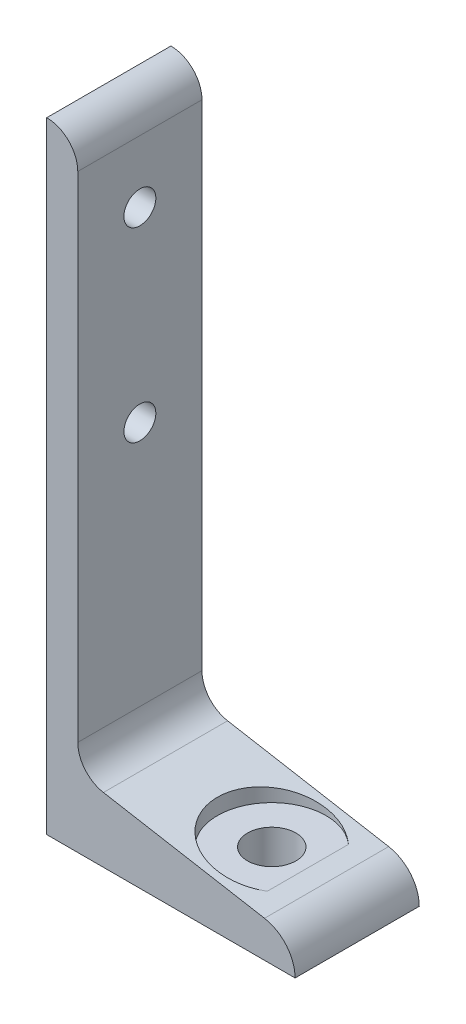
ISO-10303-21;
HEADER;
FILE_DESCRIPTION(('STEP AP214'),'2;1');
FILE_NAME('part.step','',(''),(''),'','','');
FILE_SCHEMA(('AUTOMOTIVE_DESIGN { 1 0 10303 214 1 1 1 1 }'));
ENDSEC;
DATA;
#1=APPLICATION_CONTEXT('core data for automotive mechanical design processes');
#2=APPLICATION_PROTOCOL_DEFINITION('international standard','automotive_design',2000,#1);
#3=PRODUCT_CONTEXT('',#1,'mechanical');
#4=PRODUCT('Part','Part','',(#3));
#5=PRODUCT_RELATED_PRODUCT_CATEGORY('part','',(#4));
#6=PRODUCT_DEFINITION_FORMATION('','',#4);
#7=PRODUCT_DEFINITION_CONTEXT('part definition',#1,'design');
#8=PRODUCT_DEFINITION('design','',#6,#7);
#9=PRODUCT_DEFINITION_SHAPE('','',#8);
#10=(LENGTH_UNIT() NAMED_UNIT(*) SI_UNIT(.MILLI.,.METRE.));
#11=(NAMED_UNIT(*) PLANE_ANGLE_UNIT() SI_UNIT($,.RADIAN.));
#12=(NAMED_UNIT(*) SI_UNIT($,.STERADIAN.) SOLID_ANGLE_UNIT());
#13=UNCERTAINTY_MEASURE_WITH_UNIT(LENGTH_MEASURE(1.E-05),#10,'distance_accuracy_value','');
#14=(GEOMETRIC_REPRESENTATION_CONTEXT(3) GLOBAL_UNCERTAINTY_ASSIGNED_CONTEXT((#13)) GLOBAL_UNIT_ASSIGNED_CONTEXT((#10,
#11,#12)) REPRESENTATION_CONTEXT('',''));
#15=CARTESIAN_POINT('',(0.,0.,0.));
#16=DIRECTION('',(0.,0.,1.));
#17=DIRECTION('',(1.,0.,0.));
#18=AXIS2_PLACEMENT_3D('',#15,#16,#17);
#19=CARTESIAN_POINT('',(6.34999999999999,120.65,12.7));
#20=DIRECTION('',(-1.,0.,0.));
#21=DIRECTION('',(0.,-1.,0.));
#22=AXIS2_PLACEMENT_3D('',#19,#20,#21);
#23=PLANE('',#22);
#24=CARTESIAN_POINT('',(6.35,69.85,0.));
#25=DIRECTION('',(-1.,0.,0.));
#26=DIRECTION('',(0.,-1.,0.));
#27=AXIS2_PLACEMENT_3D('',#24,#25,#26);
#28=CIRCLE('',#27,3.2639);
#29=CARTESIAN_POINT('',(6.35,66.5861,0.));
#30=VERTEX_POINT('',#29);
#31=EDGE_CURVE('E162',#30,#30,#28,.F.);
#32=ORIENTED_EDGE('',*,*,#31,.F.);
#33=EDGE_LOOP('',(#32));
#34=FACE_BOUND('',#33,.T.);
#35=DIRECTION('',(0.,1.,0.));
#36=VECTOR('',#35,1.);
#37=CARTESIAN_POINT('',(6.34999999999999,120.65,-12.7));
#38=LINE('',#37,#36);
#39=CARTESIAN_POINT('',(6.35000000000001,19.5160169504667,-12.7));
#40=VERTEX_POINT('',#39);
#41=CARTESIAN_POINT('',(6.34999999999999,120.65,-12.7));
#42=VERTEX_POINT('',#41);
#43=EDGE_CURVE('E120',#40,#42,#38,.T.);
#44=ORIENTED_EDGE('',*,*,#43,.T.);
#45=DIRECTION('',(0.,0.,-1.));
#46=VECTOR('',#45,1.);
#47=CARTESIAN_POINT('',(6.34999999999999,120.65,12.7));
#48=LINE('',#47,#46);
#49=CARTESIAN_POINT('',(6.34999999999999,120.65,12.7));
#50=VERTEX_POINT('',#49);
#51=EDGE_CURVE('E117',#50,#42,#48,.T.);
#52=ORIENTED_EDGE('',*,*,#51,.F.);
#53=DIRECTION('',(0.,1.,0.));
#54=VECTOR('',#53,1.);
#55=CARTESIAN_POINT('',(6.34999999999999,120.65,12.7));
#56=LINE('',#55,#54);
#57=CARTESIAN_POINT('',(6.35000000000001,19.5160169504667,12.7));
#58=VERTEX_POINT('',#57);
#59=EDGE_CURVE('E104',#58,#50,#56,.T.);
#60=ORIENTED_EDGE('',*,*,#59,.F.);
#61=DIRECTION('',(0.,0.,-1.));
#62=VECTOR('',#61,1.);
#63=CARTESIAN_POINT('',(6.35000000000001,19.5160169504667,12.7));
#64=LINE('',#63,#62);
#65=EDGE_CURVE('E123',#58,#40,#64,.T.);
#66=ORIENTED_EDGE('',*,*,#65,.T.);
#67=EDGE_LOOP('',(#44,#52,#60,#66));
#68=FACE_BOUND('',#67,.T.);
#69=CARTESIAN_POINT('',(6.34999999999999,107.95,0.));
#70=DIRECTION('',(-1.,0.,0.));
#71=DIRECTION('',(0.,-1.,0.));
#72=AXIS2_PLACEMENT_3D('',#69,#70,#71);
#73=CIRCLE('',#72,3.2639);
#74=CARTESIAN_POINT('',(6.34999999999999,104.6861,0.));
#75=VERTEX_POINT('',#74);
#76=EDGE_CURVE('E256',#75,#75,#73,.F.);
#77=ORIENTED_EDGE('',*,*,#76,.F.);
#78=EDGE_LOOP('',(#77));
#79=FACE_BOUND('',#78,.T.);
#80=ADVANCED_FACE('F32',(#34,#68,#79),#23,.F.);
#81=CARTESIAN_POINT('',(0.,0.,12.7));
#82=DIRECTION('',(1.,0.,0.));
#83=DIRECTION('',(0.,0.,-1.));
#84=AXIS2_PLACEMENT_3D('',#81,#82,#83);
#85=PLANE('',#84);
#86=CARTESIAN_POINT('',(0.,69.85,0.));
#87=DIRECTION('',(1.,0.,0.));
#88=DIRECTION('',(0.,0.,-1.));
#89=AXIS2_PLACEMENT_3D('',#86,#87,#88);
#90=CIRCLE('',#89,3.2639);
#91=CARTESIAN_POINT('',(0.,69.85,-3.2639));
#92=VERTEX_POINT('',#91);
#93=EDGE_CURVE('E165',#92,#92,#90,.T.);
#94=ORIENTED_EDGE('',*,*,#93,.T.);
#95=EDGE_LOOP('',(#94));
#96=FACE_BOUND('',#95,.T.);
#97=DIRECTION('',(0.,-1.,0.));
#98=VECTOR('',#97,1.);
#99=CARTESIAN_POINT('',(0.,0.,-12.7));
#100=LINE('',#99,#98);
#101=CARTESIAN_POINT('',(0.,127.,-12.7));
#102=VERTEX_POINT('',#101);
#103=CARTESIAN_POINT('',(0.,0.,-12.7));
#104=VERTEX_POINT('',#103);
#105=EDGE_CURVE('E84',#102,#104,#100,.T.);
#106=ORIENTED_EDGE('',*,*,#105,.T.);
#107=DIRECTION('',(0.,0.,-1.));
#108=VECTOR('',#107,1.);
#109=CARTESIAN_POINT('',(0.,0.,12.7));
#110=LINE('',#109,#108);
#111=CARTESIAN_POINT('',(0.,0.,12.7));
#112=VERTEX_POINT('',#111);
#113=EDGE_CURVE('E128',#112,#104,#110,.T.);
#114=ORIENTED_EDGE('',*,*,#113,.F.);
#115=DIRECTION('',(0.,-1.,0.));
#116=VECTOR('',#115,1.);
#117=CARTESIAN_POINT('',(0.,0.,12.7));
#118=LINE('',#117,#116);
#119=CARTESIAN_POINT('',(0.,127.,12.7));
#120=VERTEX_POINT('',#119);
#121=EDGE_CURVE('E54',#120,#112,#118,.T.);
#122=ORIENTED_EDGE('',*,*,#121,.F.);
#123=DIRECTION('',(0.,0.,-1.));
#124=VECTOR('',#123,1.);
#125=CARTESIAN_POINT('',(0.,127.,12.7));
#126=LINE('',#125,#124);
#127=EDGE_CURVE('E124',#120,#102,#126,.T.);
#128=ORIENTED_EDGE('',*,*,#127,.T.);
#129=EDGE_LOOP('',(#106,#114,#122,#128));
#130=FACE_BOUND('',#129,.T.);
#131=CARTESIAN_POINT('',(0.,107.95,0.));
#132=DIRECTION('',(1.,0.,0.));
#133=DIRECTION('',(0.,0.,-1.));
#134=AXIS2_PLACEMENT_3D('',#131,#132,#133);
#135=CIRCLE('',#134,3.2639);
#136=CARTESIAN_POINT('',(0.,107.95,-3.2639));
#137=VERTEX_POINT('',#136);
#138=EDGE_CURVE('E253',#137,#137,#135,.T.);
#139=ORIENTED_EDGE('',*,*,#138,.T.);
#140=EDGE_LOOP('',(#139));
#141=FACE_BOUND('',#140,.T.);
#142=ADVANCED_FACE('F186',(#96,#130,#141),#85,.F.);
#143=CARTESIAN_POINT('',(11.597334071815,13.2624877188392,12.7));
#144=DIRECTION('',(-0.173648177666923,-0.984807753012209,0.));
#145=DIRECTION('',(0.984807753012209,-0.173648177666923,0.));
#146=AXIS2_PLACEMENT_3D('',#143,#144,#145);
#147=PLANE('',#146);
#148=DIRECTION('',(-0.984807753012209,0.173648177666923,0.));
#149=VECTOR('',#148,1.);
#150=CARTESIAN_POINT('',(11.597334071815,13.2624877188392,-12.7));
#151=LINE('',#150,#149);
#152=CARTESIAN_POINT('',(44.5464707683725,7.45266592818496,-12.7));
#153=VERTEX_POINT('',#152);
#154=CARTESIAN_POINT('',(11.597334071815,13.2624877188392,-12.7));
#155=VERTEX_POINT('',#154);
#156=EDGE_CURVE('E138',#153,#155,#151,.T.);
#157=ORIENTED_EDGE('',*,*,#156,.T.);
#158=DIRECTION('',(0.,0.,-1.));
#159=VECTOR('',#158,1.);
#160=CARTESIAN_POINT('',(11.597334071815,13.2624877188392,12.7));
#161=LINE('',#160,#159);
#162=CARTESIAN_POINT('',(11.597334071815,13.2624877188392,12.7));
#163=VERTEX_POINT('',#162);
#164=EDGE_CURVE('E150',#163,#155,#161,.T.);
#165=ORIENTED_EDGE('',*,*,#164,.F.);
#166=DIRECTION('',(-0.984807753012209,0.173648177666923,0.));
#167=VECTOR('',#166,1.);
#168=CARTESIAN_POINT('',(11.597334071815,13.2624877188392,12.7));
#169=LINE('',#168,#167);
#170=CARTESIAN_POINT('',(44.5464707683725,7.45266592818496,12.7));
#171=VERTEX_POINT('',#170);
#172=EDGE_CURVE('E173',#171,#163,#169,.T.);
#173=ORIENTED_EDGE('',*,*,#172,.F.);
#174=DIRECTION('',(0.,0.,-1.));
#175=VECTOR('',#174,1.);
#176=CARTESIAN_POINT('',(44.5464707683725,7.45266592818496,12.7));
#177=LINE('',#176,#175);
#178=EDGE_CURVE('E153',#171,#153,#177,.T.);
#179=ORIENTED_EDGE('',*,*,#178,.T.);
#180=EDGE_LOOP('',(#157,#165,#173,#179));
#181=FACE_BOUND('',#180,.T.);
#182=CARTESIAN_POINT('',(33.3248,9.43134925327645,0.));
#183=DIRECTION('',(-0.173648177666923,-0.984807753012209,0.));
#184=DIRECTION('',(0.984807753012209,-0.173648177666923,0.));
#185=AXIS2_PLACEMENT_3D('',#182,#183,#184);
#186=ELLIPSE('',#185,11.2839282245803,11.1125);
#187=CARTESIAN_POINT('',(40.7164609247193,8.128,-8.29765057254029));
#188=VERTEX_POINT('',#187);
#189=CARTESIAN_POINT('',(40.7164609247193,8.128,8.29765057254029));
#190=VERTEX_POINT('',#189);
#191=EDGE_CURVE('E11',#188,#190,#186,.F.);
#192=ORIENTED_EDGE('',*,*,#191,.F.);
#193=DIRECTION('',(0.,0.,-1.));
#194=VECTOR('',#193,1.);
#195=CARTESIAN_POINT('',(40.7164609247193,8.128,12.7));
#196=LINE('',#195,#194);
#197=EDGE_CURVE('E158',#190,#188,#196,.T.);
#198=ORIENTED_EDGE('',*,*,#197,.F.);
#199=EDGE_LOOP('',(#192,#198));
#200=FACE_BOUND('',#199,.T.);
#201=ADVANCED_FACE('F177',(#181,#200),#147,.F.);
#202=CARTESIAN_POINT('',(33.3248,127.,0.));
#203=DIRECTION('',(0.,-1.,0.));
#204=DIRECTION('',(0.,0.,-1.));
#205=AXIS2_PLACEMENT_3D('',#202,#203,#204);
#206=CYLINDRICAL_SURFACE('',#205,4.95299999999999);
#207=CARTESIAN_POINT('',(33.3248,0.,0.));
#208=DIRECTION('',(0.,1.,0.));
#209=DIRECTION('',(0.,0.,1.));
#210=AXIS2_PLACEMENT_3D('',#207,#208,#209);
#211=CIRCLE('',#210,4.95299999999999);
#212=CARTESIAN_POINT('',(33.3248,0.,4.95299999999999));
#213=VERTEX_POINT('',#212);
#214=EDGE_CURVE('E136',#213,#213,#211,.T.);
#215=ORIENTED_EDGE('',*,*,#214,.F.);
#216=EDGE_LOOP('',(#215));
#217=FACE_BOUND('',#216,.T.);
#218=CARTESIAN_POINT('',(33.3248,8.128,0.));
#219=DIRECTION('',(0.,1.,0.));
#220=DIRECTION('',(0.,0.,1.));
#221=AXIS2_PLACEMENT_3D('',#218,#219,#220);
#222=CIRCLE('',#221,4.95299999999999);
#223=CARTESIAN_POINT('',(33.3248,8.128,4.95299999999999));
#224=VERTEX_POINT('',#223);
#225=EDGE_CURVE('E156',#224,#224,#222,.T.);
#226=ORIENTED_EDGE('',*,*,#225,.T.);
#227=EDGE_LOOP('',(#226));
#228=FACE_BOUND('',#227,.T.);
#229=ADVANCED_FACE('F199',(#217,#228),#206,.F.);
#230=CARTESIAN_POINT('',(50.8,0.,12.7));
#231=DIRECTION('',(0.,1.,0.));
#232=DIRECTION('',(-1.,0.,0.));
#233=AXIS2_PLACEMENT_3D('',#230,#231,#232);
#234=PLANE('',#233);
#235=DIRECTION('',(1.,0.,0.));
#236=VECTOR('',#235,1.);
#237=CARTESIAN_POINT('',(50.8,0.,-12.7));
#238=LINE('',#237,#236);
#239=CARTESIAN_POINT('',(50.8,0.,-12.7));
#240=VERTEX_POINT('',#239);
#241=EDGE_CURVE('E132',#104,#240,#238,.T.);
#242=ORIENTED_EDGE('',*,*,#241,.T.);
#243=DIRECTION('',(0.,0.,-1.));
#244=VECTOR('',#243,1.);
#245=CARTESIAN_POINT('',(50.8,0.,12.7));
#246=LINE('',#245,#244);
#247=CARTESIAN_POINT('',(50.8,0.,12.7));
#248=VERTEX_POINT('',#247);
#249=EDGE_CURVE('E40',#248,#240,#246,.T.);
#250=ORIENTED_EDGE('',*,*,#249,.F.);
#251=DIRECTION('',(1.,0.,0.));
#252=VECTOR('',#251,1.);
#253=CARTESIAN_POINT('',(50.8,0.,12.7));
#254=LINE('',#253,#252);
#255=EDGE_CURVE('E146',#112,#248,#254,.T.);
#256=ORIENTED_EDGE('',*,*,#255,.F.);
#257=ORIENTED_EDGE('',*,*,#113,.T.);
#258=EDGE_LOOP('',(#242,#250,#256,#257));
#259=FACE_BOUND('',#258,.T.);
#260=ORIENTED_EDGE('',*,*,#214,.T.);
#261=EDGE_LOOP('',(#260));
#262=FACE_BOUND('',#261,.T.);
#263=ADVANCED_FACE('F34',(#259,#262),#234,.F.);
#264=CARTESIAN_POINT('',(43.2323646870268,0.,12.7));
#265=DIRECTION('',(0.,0.,-1.));
#266=DIRECTION('',(-1.,0.,0.));
#267=AXIS2_PLACEMENT_3D('',#264,#265,#266);
#268=CYLINDRICAL_SURFACE('',#267,7.56763531297318);
#269=CARTESIAN_POINT('',(43.2323646870268,0.,-12.7));
#270=DIRECTION('',(0.,0.,1.));
#271=DIRECTION('',(1.,0.,0.));
#272=AXIS2_PLACEMENT_3D('',#269,#270,#271);
#273=CIRCLE('',#272,7.56763531297318);
#274=EDGE_CURVE('E135',#240,#153,#273,.T.);
#275=ORIENTED_EDGE('',*,*,#274,.T.);
#276=ORIENTED_EDGE('',*,*,#178,.F.);
#277=CARTESIAN_POINT('',(43.2323646870268,0.,12.7));
#278=DIRECTION('',(0.,0.,1.));
#279=DIRECTION('',(1.,0.,0.));
#280=AXIS2_PLACEMENT_3D('',#277,#278,#279);
#281=CIRCLE('',#280,7.56763531297318);
#282=EDGE_CURVE('E93',#248,#171,#281,.T.);
#283=ORIENTED_EDGE('',*,*,#282,.F.);
#284=ORIENTED_EDGE('',*,*,#249,.T.);
#285=EDGE_LOOP('',(#275,#276,#283,#284));
#286=FACE_BOUND('',#285,.T.);
#287=ADVANCED_FACE('F192',(#286),#268,.T.);
#288=CARTESIAN_POINT('',(12.7,19.5160169504667,12.7));
#289=DIRECTION('',(0.,0.,-1.));
#290=DIRECTION('',(-1.,0.,0.));
#291=AXIS2_PLACEMENT_3D('',#288,#289,#290);
#292=CYLINDRICAL_SURFACE('',#291,6.35);
#293=CARTESIAN_POINT('',(12.7,19.5160169504667,-12.7));
#294=DIRECTION('',(0.,0.,-1.));
#295=DIRECTION('',(1.,0.,0.));
#296=AXIS2_PLACEMENT_3D('',#293,#294,#295);
#297=CIRCLE('',#296,6.35);
#298=EDGE_CURVE('E140',#155,#40,#297,.T.);
#299=ORIENTED_EDGE('',*,*,#298,.T.);
#300=ORIENTED_EDGE('',*,*,#65,.F.);
#301=CARTESIAN_POINT('',(12.7,19.5160169504667,12.7));
#302=DIRECTION('',(0.,0.,-1.));
#303=DIRECTION('',(1.,0.,0.));
#304=AXIS2_PLACEMENT_3D('',#301,#302,#303);
#305=CIRCLE('',#304,6.35);
#306=EDGE_CURVE('E111',#163,#58,#305,.T.);
#307=ORIENTED_EDGE('',*,*,#306,.F.);
#308=ORIENTED_EDGE('',*,*,#164,.T.);
#309=EDGE_LOOP('',(#299,#300,#307,#308));
#310=FACE_BOUND('',#309,.T.);
#311=ADVANCED_FACE('F182',(#310),#292,.F.);
#312=CARTESIAN_POINT('',(0.,120.65,12.7));
#313=DIRECTION('',(0.,0.,-1.));
#314=DIRECTION('',(-1.,0.,0.));
#315=AXIS2_PLACEMENT_3D('',#312,#313,#314);
#316=CYLINDRICAL_SURFACE('',#315,6.34999999999999);
#317=CARTESIAN_POINT('',(0.,120.65,-12.7));
#318=DIRECTION('',(0.,0.,1.));
#319=DIRECTION('',(1.,0.,0.));
#320=AXIS2_PLACEMENT_3D('',#317,#318,#319);
#321=CIRCLE('',#320,6.34999999999999);
#322=EDGE_CURVE('E143',#42,#102,#321,.T.);
#323=ORIENTED_EDGE('',*,*,#322,.T.);
#324=ORIENTED_EDGE('',*,*,#127,.F.);
#325=CARTESIAN_POINT('',(0.,120.65,12.7));
#326=DIRECTION('',(0.,0.,1.));
#327=DIRECTION('',(1.,0.,0.));
#328=AXIS2_PLACEMENT_3D('',#325,#326,#327);
#329=CIRCLE('',#328,6.34999999999999);
#330=EDGE_CURVE('E108',#50,#120,#329,.T.);
#331=ORIENTED_EDGE('',*,*,#330,.F.);
#332=ORIENTED_EDGE('',*,*,#51,.T.);
#333=EDGE_LOOP('',(#323,#324,#331,#332));
#334=FACE_BOUND('',#333,.T.);
#335=ADVANCED_FACE('F126',(#334),#316,.T.);
#336=CARTESIAN_POINT('',(0.,120.65,12.7));
#337=DIRECTION('',(0.,0.,1.));
#338=DIRECTION('',(1.,0.,0.));
#339=AXIS2_PLACEMENT_3D('',#336,#337,#338);
#340=PLANE('',#339);
#341=ORIENTED_EDGE('',*,*,#255,.T.);
#342=ORIENTED_EDGE('',*,*,#282,.T.);
#343=ORIENTED_EDGE('',*,*,#172,.T.);
#344=ORIENTED_EDGE('',*,*,#306,.T.);
#345=ORIENTED_EDGE('',*,*,#59,.T.);
#346=ORIENTED_EDGE('',*,*,#330,.T.);
#347=ORIENTED_EDGE('',*,*,#121,.T.);
#348=EDGE_LOOP('',(#341,#342,#343,#344,#345,#346,#347));
#349=FACE_BOUND('',#348,.T.);
#350=ADVANCED_FACE('F106',(#349),#340,.T.);
#351=CARTESIAN_POINT('',(0.,120.65,-12.7));
#352=DIRECTION('',(0.,0.,1.));
#353=DIRECTION('',(1.,0.,0.));
#354=AXIS2_PLACEMENT_3D('',#351,#352,#353);
#355=PLANE('',#354);
#356=ORIENTED_EDGE('',*,*,#241,.F.);
#357=ORIENTED_EDGE('',*,*,#105,.F.);
#358=ORIENTED_EDGE('',*,*,#322,.F.);
#359=ORIENTED_EDGE('',*,*,#43,.F.);
#360=ORIENTED_EDGE('',*,*,#298,.F.);
#361=ORIENTED_EDGE('',*,*,#156,.F.);
#362=ORIENTED_EDGE('',*,*,#274,.F.);
#363=EDGE_LOOP('',(#356,#357,#358,#359,#360,#361,#362));
#364=FACE_BOUND('',#363,.T.);
#365=ADVANCED_FACE('F185',(#364),#355,.F.);
#366=CARTESIAN_POINT('',(33.3248,127.,0.));
#367=DIRECTION('',(0.,-1.,0.));
#368=DIRECTION('',(0.,0.,-1.));
#369=AXIS2_PLACEMENT_3D('',#366,#367,#368);
#370=CYLINDRICAL_SURFACE('',#369,11.1125);
#371=ORIENTED_EDGE('',*,*,#191,.T.);
#372=CARTESIAN_POINT('',(33.3248,8.128,0.));
#373=DIRECTION('',(0.,1.,0.));
#374=DIRECTION('',(0.,0.,1.));
#375=AXIS2_PLACEMENT_3D('',#372,#373,#374);
#376=CIRCLE('',#375,11.1125);
#377=EDGE_CURVE('E46',#188,#190,#376,.T.);
#378=ORIENTED_EDGE('',*,*,#377,.F.);
#379=EDGE_LOOP('',(#371,#378));
#380=FACE_BOUND('',#379,.T.);
#381=ADVANCED_FACE('F222',(#380),#370,.F.);
#382=CARTESIAN_POINT('',(33.3248,8.128,0.));
#383=DIRECTION('',(0.,1.,0.));
#384=DIRECTION('',(0.,0.,1.));
#385=AXIS2_PLACEMENT_3D('',#382,#383,#384);
#386=PLANE('',#385);
#387=ORIENTED_EDGE('',*,*,#225,.F.);
#388=EDGE_LOOP('',(#387));
#389=FACE_BOUND('',#388,.T.);
#390=ORIENTED_EDGE('',*,*,#197,.T.);
#391=ORIENTED_EDGE('',*,*,#377,.T.);
#392=EDGE_LOOP('',(#390,#391));
#393=FACE_BOUND('',#392,.T.);
#394=ADVANCED_FACE('F230',(#389,#393),#386,.T.);
#395=CARTESIAN_POINT('',(50.8,69.85,0.));
#396=DIRECTION('',(-1.,0.,0.));
#397=DIRECTION('',(0.,0.,1.));
#398=AXIS2_PLACEMENT_3D('',#395,#396,#397);
#399=CYLINDRICAL_SURFACE('',#398,3.2639);
#400=ORIENTED_EDGE('',*,*,#93,.F.);
#401=EDGE_LOOP('',(#400));
#402=FACE_BOUND('',#401,.T.);
#403=ORIENTED_EDGE('',*,*,#31,.T.);
#404=EDGE_LOOP('',(#403));
#405=FACE_BOUND('',#404,.T.);
#406=ADVANCED_FACE('F235',(#402,#405),#399,.F.);
#407=CARTESIAN_POINT('',(50.8,107.95,0.));
#408=DIRECTION('',(-1.,0.,0.));
#409=DIRECTION('',(0.,0.,1.));
#410=AXIS2_PLACEMENT_3D('',#407,#408,#409);
#411=CYLINDRICAL_SURFACE('',#410,3.2639);
#412=ORIENTED_EDGE('',*,*,#138,.F.);
#413=EDGE_LOOP('',(#412));
#414=FACE_BOUND('',#413,.T.);
#415=ORIENTED_EDGE('',*,*,#76,.T.);
#416=EDGE_LOOP('',(#415));
#417=FACE_BOUND('',#416,.T.);
#418=ADVANCED_FACE('F242',(#414,#417),#411,.F.);
#419=CLOSED_SHELL('',(#80,#142,#201,#229,#263,#287,#311,#335,#350,#365,#381,#394,#406,#418));
#420=MANIFOLD_SOLID_BREP('B2',#419);
#421=ADVANCED_BREP_SHAPE_REPRESENTATION('',(#18,#420),#14);
#422=SHAPE_DEFINITION_REPRESENTATION(#9,#421);
ENDSEC;
END-ISO-10303-21;
